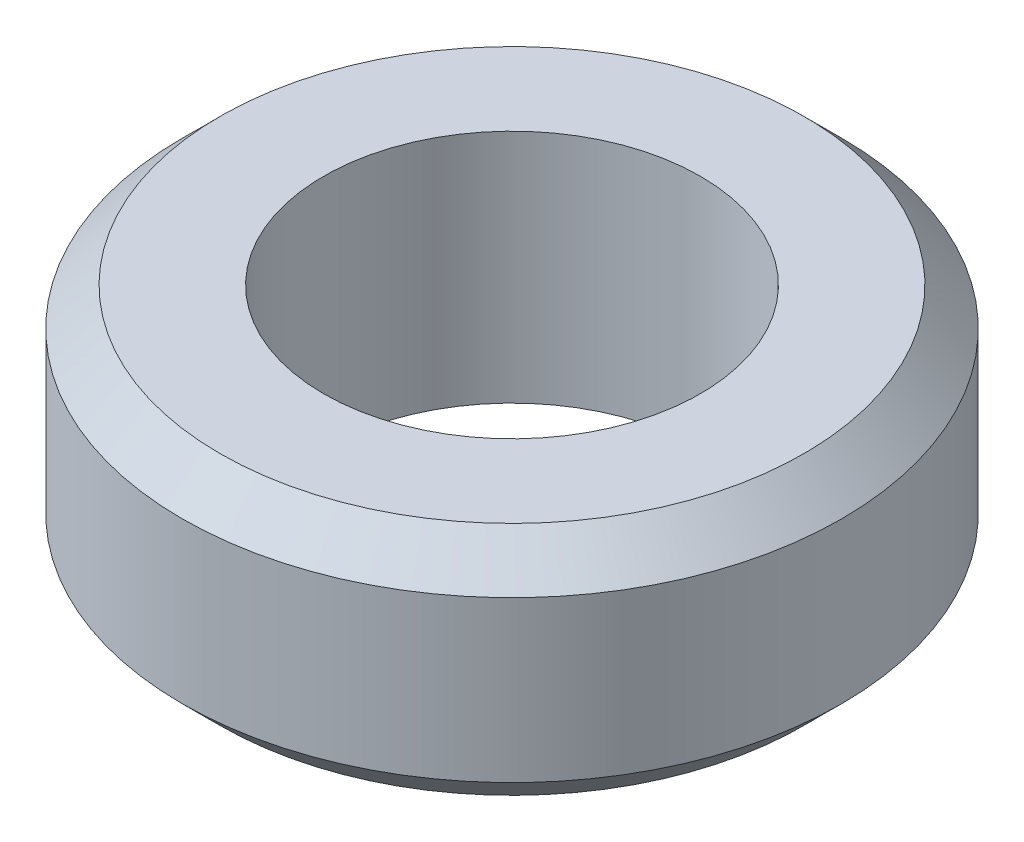
ISO-10303-21;
HEADER;
FILE_DESCRIPTION(('STEP AP214'),'2;1');
FILE_NAME('part.step','',(''),(''),'','','');
FILE_SCHEMA(('AUTOMOTIVE_DESIGN { 1 0 10303 214 1 1 1 1 }'));
ENDSEC;
DATA;
#1=APPLICATION_CONTEXT('core data for automotive mechanical design processes');
#2=APPLICATION_PROTOCOL_DEFINITION('international standard','automotive_design',2000,#1);
#3=PRODUCT_CONTEXT('',#1,'mechanical');
#4=PRODUCT('Part','Part','',(#3));
#5=PRODUCT_RELATED_PRODUCT_CATEGORY('part','',(#4));
#6=PRODUCT_DEFINITION_FORMATION('','',#4);
#7=PRODUCT_DEFINITION_CONTEXT('part definition',#1,'design');
#8=PRODUCT_DEFINITION('design','',#6,#7);
#9=PRODUCT_DEFINITION_SHAPE('','',#8);
#10=(LENGTH_UNIT() NAMED_UNIT(*) SI_UNIT(.MILLI.,.METRE.));
#11=(NAMED_UNIT(*) PLANE_ANGLE_UNIT() SI_UNIT($,.RADIAN.));
#12=(NAMED_UNIT(*) SI_UNIT($,.STERADIAN.) SOLID_ANGLE_UNIT());
#13=UNCERTAINTY_MEASURE_WITH_UNIT(LENGTH_MEASURE(1.E-05),#10,'distance_accuracy_value','');
#14=(GEOMETRIC_REPRESENTATION_CONTEXT(3) GLOBAL_UNCERTAINTY_ASSIGNED_CONTEXT((#13)) GLOBAL_UNIT_ASSIGNED_CONTEXT((#10,
#11,#12)) REPRESENTATION_CONTEXT('',''));
#15=CARTESIAN_POINT('',(0.,0.,0.));
#16=DIRECTION('',(0.,0.,1.));
#17=DIRECTION('',(1.,0.,0.));
#18=AXIS2_PLACEMENT_3D('',#15,#16,#17);
#19=CARTESIAN_POINT('',(0.,2.5,0.));
#20=DIRECTION('',(0.,1.,0.));
#21=DIRECTION('',(0.,0.,1.));
#22=AXIS2_PLACEMENT_3D('',#19,#20,#21);
#23=PLANE('',#22);
#24=CARTESIAN_POINT('',(0.,2.5,0.));
#25=DIRECTION('',(0.,1.,0.));
#26=DIRECTION('',(0.,0.,1.));
#27=AXIS2_PLACEMENT_3D('',#24,#25,#26);
#28=CIRCLE('',#27,3.1);
#29=CARTESIAN_POINT('',(0.,2.5,3.1));
#30=VERTEX_POINT('',#29);
#31=EDGE_CURVE('E10',#30,#30,#28,.T.);
#32=ORIENTED_EDGE('',*,*,#31,.T.);
#33=EDGE_LOOP('',(#32));
#34=FACE_BOUND('',#33,.T.);
#35=CARTESIAN_POINT('',(0.,2.5,0.));
#36=DIRECTION('',(0.,1.,0.));
#37=DIRECTION('',(0.,0.,1.));
#38=AXIS2_PLACEMENT_3D('',#35,#36,#37);
#39=CIRCLE('',#38,2.);
#40=CARTESIAN_POINT('',(0.,2.5,2.));
#41=VERTEX_POINT('',#40);
#42=EDGE_CURVE('E52',#41,#41,#39,.T.);
#43=ORIENTED_EDGE('',*,*,#42,.F.);
#44=EDGE_LOOP('',(#43));
#45=FACE_BOUND('',#44,.T.);
#46=ADVANCED_FACE('F32',(#34,#45),#23,.T.);
#47=CARTESIAN_POINT('',(0.,0.,0.));
#48=DIRECTION('',(0.,1.,0.));
#49=DIRECTION('',(0.,0.,1.));
#50=AXIS2_PLACEMENT_3D('',#47,#48,#49);
#51=PLANE('',#50);
#52=CARTESIAN_POINT('',(0.,0.,0.));
#53=DIRECTION('',(0.,1.,0.));
#54=DIRECTION('',(0.,0.,1.));
#55=AXIS2_PLACEMENT_3D('',#52,#53,#54);
#56=CIRCLE('',#55,3.1);
#57=CARTESIAN_POINT('',(0.,0.,3.1));
#58=VERTEX_POINT('',#57);
#59=EDGE_CURVE('E39',#58,#58,#56,.F.);
#60=ORIENTED_EDGE('',*,*,#59,.T.);
#61=EDGE_LOOP('',(#60));
#62=FACE_BOUND('',#61,.T.);
#63=CARTESIAN_POINT('',(0.,0.,0.));
#64=DIRECTION('',(0.,1.,0.));
#65=DIRECTION('',(0.,0.,1.));
#66=AXIS2_PLACEMENT_3D('',#63,#64,#65);
#67=CIRCLE('',#66,2.);
#68=CARTESIAN_POINT('',(0.,0.,2.));
#69=VERTEX_POINT('',#68);
#70=EDGE_CURVE('E53',#69,#69,#67,.T.);
#71=ORIENTED_EDGE('',*,*,#70,.T.);
#72=EDGE_LOOP('',(#71));
#73=FACE_BOUND('',#72,.T.);
#74=ADVANCED_FACE('F63',(#62,#73),#51,.F.);
#75=CARTESIAN_POINT('',(0.,2.5,0.));
#76=DIRECTION('',(0.,-1.,0.));
#77=DIRECTION('',(0.,0.,-1.));
#78=AXIS2_PLACEMENT_3D('',#75,#76,#77);
#79=CYLINDRICAL_SURFACE('',#78,3.5);
#80=CARTESIAN_POINT('',(0.,0.400000000000002,0.));
#81=DIRECTION('',(0.,1.,0.));
#82=DIRECTION('',(0.,0.,1.));
#83=AXIS2_PLACEMENT_3D('',#80,#81,#82);
#84=CIRCLE('',#83,3.5);
#85=CARTESIAN_POINT('',(0.,0.400000000000002,3.5));
#86=VERTEX_POINT('',#85);
#87=EDGE_CURVE('E43',#86,#86,#84,.T.);
#88=ORIENTED_EDGE('',*,*,#87,.T.);
#89=EDGE_LOOP('',(#88));
#90=FACE_BOUND('',#89,.T.);
#91=CARTESIAN_POINT('',(0.,2.1,0.));
#92=DIRECTION('',(0.,1.,0.));
#93=DIRECTION('',(0.,0.,1.));
#94=AXIS2_PLACEMENT_3D('',#91,#92,#93);
#95=CIRCLE('',#94,3.5);
#96=CARTESIAN_POINT('',(0.,2.1,3.5));
#97=VERTEX_POINT('',#96);
#98=EDGE_CURVE('E47',#97,#97,#95,.F.);
#99=ORIENTED_EDGE('',*,*,#98,.T.);
#100=EDGE_LOOP('',(#99));
#101=FACE_BOUND('',#100,.T.);
#102=ADVANCED_FACE('F68',(#90,#101),#79,.T.);
#103=CARTESIAN_POINT('',(0.,2.5,0.));
#104=DIRECTION('',(0.,-1.,0.));
#105=DIRECTION('',(0.,0.,-1.));
#106=AXIS2_PLACEMENT_3D('',#103,#104,#105);
#107=CYLINDRICAL_SURFACE('',#106,2.);
#108=ORIENTED_EDGE('',*,*,#42,.T.);
#109=EDGE_LOOP('',(#108));
#110=FACE_BOUND('',#109,.T.);
#111=ORIENTED_EDGE('',*,*,#70,.F.);
#112=EDGE_LOOP('',(#111));
#113=FACE_BOUND('',#112,.T.);
#114=ADVANCED_FACE('F59',(#110,#113),#107,.F.);
#115=CARTESIAN_POINT('',(0.,0.400000000000002,0.));
#116=DIRECTION('',(0.,1.,0.));
#117=DIRECTION('',(0.,0.,1.));
#118=AXIS2_PLACEMENT_3D('',#115,#116,#117);
#119=CONICAL_SURFACE('',#118,3.5,0.78539816339745);
#120=ORIENTED_EDGE('',*,*,#59,.F.);
#121=EDGE_LOOP('',(#120));
#122=FACE_BOUND('',#121,.T.);
#123=ORIENTED_EDGE('',*,*,#87,.F.);
#124=EDGE_LOOP('',(#123));
#125=FACE_BOUND('',#124,.T.);
#126=ADVANCED_FACE('F74',(#122,#125),#119,.T.);
#127=CARTESIAN_POINT('',(0.,2.5,0.));
#128=DIRECTION('',(0.,-1.,0.));
#129=DIRECTION('',(0.,0.,-1.));
#130=AXIS2_PLACEMENT_3D('',#127,#128,#129);
#131=CONICAL_SURFACE('',#130,3.1,0.785398163397447);
#132=ORIENTED_EDGE('',*,*,#98,.F.);
#133=EDGE_LOOP('',(#132));
#134=FACE_BOUND('',#133,.T.);
#135=ORIENTED_EDGE('',*,*,#31,.F.);
#136=EDGE_LOOP('',(#135));
#137=FACE_BOUND('',#136,.T.);
#138=ADVANCED_FACE('F34',(#134,#137),#131,.T.);
#139=CLOSED_SHELL('',(#46,#74,#102,#114,#126,#138));
#140=MANIFOLD_SOLID_BREP('B2',#139);
#141=ADVANCED_BREP_SHAPE_REPRESENTATION('',(#18,#140),#14);
#142=SHAPE_DEFINITION_REPRESENTATION(#9,#141);
ENDSEC;
END-ISO-10303-21;
